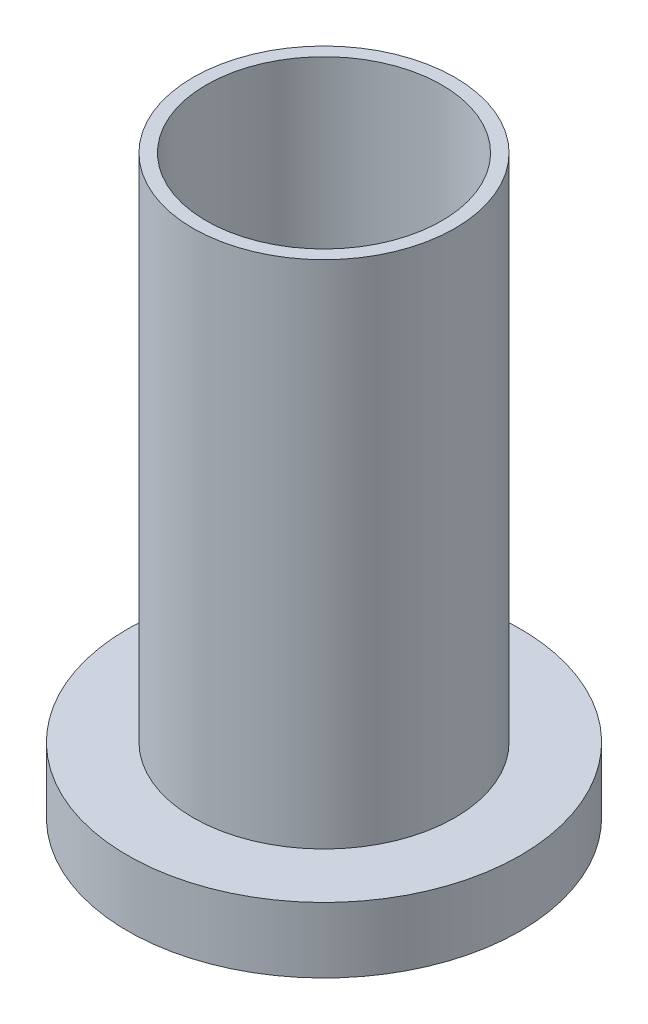
ISO-10303-21;
HEADER;
FILE_DESCRIPTION(('STEP AP214'),'2;1');
FILE_NAME('part.step','',(''),(''),'','','');
FILE_SCHEMA(('AUTOMOTIVE_DESIGN { 1 0 10303 214 1 1 1 1 }'));
ENDSEC;
DATA;
#1=APPLICATION_CONTEXT('core data for automotive mechanical design processes');
#2=APPLICATION_PROTOCOL_DEFINITION('international standard','automotive_design',2000,#1);
#3=PRODUCT_CONTEXT('',#1,'mechanical');
#4=PRODUCT('Part','Part','',(#3));
#5=PRODUCT_RELATED_PRODUCT_CATEGORY('part','',(#4));
#6=PRODUCT_DEFINITION_FORMATION('','',#4);
#7=PRODUCT_DEFINITION_CONTEXT('part definition',#1,'design');
#8=PRODUCT_DEFINITION('design','',#6,#7);
#9=PRODUCT_DEFINITION_SHAPE('','',#8);
#10=(LENGTH_UNIT() NAMED_UNIT(*) SI_UNIT(.MILLI.,.METRE.));
#11=(NAMED_UNIT(*) PLANE_ANGLE_UNIT() SI_UNIT($,.RADIAN.));
#12=(NAMED_UNIT(*) SI_UNIT($,.STERADIAN.) SOLID_ANGLE_UNIT());
#13=UNCERTAINTY_MEASURE_WITH_UNIT(LENGTH_MEASURE(1.E-05),#10,'distance_accuracy_value','');
#14=(GEOMETRIC_REPRESENTATION_CONTEXT(3) GLOBAL_UNCERTAINTY_ASSIGNED_CONTEXT((#13)) GLOBAL_UNIT_ASSIGNED_CONTEXT((#10,
#11,#12)) REPRESENTATION_CONTEXT('',''));
#15=CARTESIAN_POINT('',(0.,0.,0.));
#16=DIRECTION('',(0.,0.,1.));
#17=DIRECTION('',(1.,0.,0.));
#18=AXIS2_PLACEMENT_3D('',#15,#16,#17);
#19=CARTESIAN_POINT('',(1.5,0.,0.));
#20=DIRECTION('',(0.,-1.,0.));
#21=DIRECTION('',(1.,0.,0.));
#22=AXIS2_PLACEMENT_3D('',#19,#20,#21);
#23=PLANE('',#22);
#24=CARTESIAN_POINT('',(1.5,0.,0.));
#25=DIRECTION('',(0.,1.,0.));
#26=DIRECTION('',(-1.,0.,0.));
#27=AXIS2_PLACEMENT_3D('',#24,#25,#26);
#28=CIRCLE('',#27,1.5);
#29=CARTESIAN_POINT('',(0.,0.,0.));
#30=VERTEX_POINT('',#29);
#31=EDGE_CURVE('E11',#30,#30,#28,.T.);
#32=ORIENTED_EDGE('',*,*,#31,.F.);
#33=EDGE_LOOP('',(#32));
#34=FACE_BOUND('',#33,.T.);
#35=ADVANCED_FACE('F43',(#34),#23,.T.);
#36=CARTESIAN_POINT('',(1.5,4.4,0.));
#37=DIRECTION('',(0.,1.,0.));
#38=DIRECTION('',(-1.,0.,0.));
#39=AXIS2_PLACEMENT_3D('',#36,#37,#38);
#40=CYLINDRICAL_SURFACE('',#39,1.5);
#41=ORIENTED_EDGE('',*,*,#31,.T.);
#42=EDGE_LOOP('',(#41));
#43=FACE_BOUND('',#42,.T.);
#44=CARTESIAN_POINT('',(1.5,0.5,0.));
#45=DIRECTION('',(0.,1.,0.));
#46=DIRECTION('',(-1.,0.,0.));
#47=AXIS2_PLACEMENT_3D('',#44,#45,#46);
#48=CIRCLE('',#47,1.5);
#49=CARTESIAN_POINT('',(0.,0.5,0.));
#50=VERTEX_POINT('',#49);
#51=EDGE_CURVE('E50',#50,#50,#48,.T.);
#52=ORIENTED_EDGE('',*,*,#51,.F.);
#53=EDGE_LOOP('',(#52));
#54=FACE_BOUND('',#53,.T.);
#55=ADVANCED_FACE('F93',(#43,#54),#40,.T.);
#56=CARTESIAN_POINT('',(0.,0.5,0.));
#57=DIRECTION('',(0.,1.,0.));
#58=DIRECTION('',(-1.,0.,0.));
#59=AXIS2_PLACEMENT_3D('',#56,#57,#58);
#60=PLANE('',#59);
#61=ORIENTED_EDGE('',*,*,#51,.T.);
#62=EDGE_LOOP('',(#61));
#63=FACE_BOUND('',#62,.T.);
#64=CARTESIAN_POINT('',(1.5,0.5,0.));
#65=DIRECTION('',(0.,1.,0.));
#66=DIRECTION('',(-1.,0.,0.));
#67=AXIS2_PLACEMENT_3D('',#64,#65,#66);
#68=CIRCLE('',#67,1.);
#69=CARTESIAN_POINT('',(0.5,0.5,0.));
#70=VERTEX_POINT('',#69);
#71=EDGE_CURVE('E55',#70,#70,#68,.T.);
#72=ORIENTED_EDGE('',*,*,#71,.F.);
#73=EDGE_LOOP('',(#72));
#74=FACE_BOUND('',#73,.T.);
#75=ADVANCED_FACE('F87',(#63,#74),#60,.T.);
#76=CARTESIAN_POINT('',(1.5,4.4,0.));
#77=DIRECTION('',(0.,1.,0.));
#78=DIRECTION('',(-1.,0.,0.));
#79=AXIS2_PLACEMENT_3D('',#76,#77,#78);
#80=CYLINDRICAL_SURFACE('',#79,1.);
#81=ORIENTED_EDGE('',*,*,#71,.T.);
#82=EDGE_LOOP('',(#81));
#83=FACE_BOUND('',#82,.T.);
#84=CARTESIAN_POINT('',(1.5,4.4,0.));
#85=DIRECTION('',(0.,1.,0.));
#86=DIRECTION('',(-1.,0.,0.));
#87=AXIS2_PLACEMENT_3D('',#84,#85,#86);
#88=CIRCLE('',#87,1.);
#89=CARTESIAN_POINT('',(0.5,4.4,0.));
#90=VERTEX_POINT('',#89);
#91=EDGE_CURVE('E60',#90,#90,#88,.T.);
#92=ORIENTED_EDGE('',*,*,#91,.F.);
#93=EDGE_LOOP('',(#92));
#94=FACE_BOUND('',#93,.T.);
#95=ADVANCED_FACE('F82',(#83,#94),#80,.T.);
#96=CARTESIAN_POINT('',(0.5,4.4,0.));
#97=DIRECTION('',(0.,1.,0.));
#98=DIRECTION('',(-1.,0.,0.));
#99=AXIS2_PLACEMENT_3D('',#96,#97,#98);
#100=PLANE('',#99);
#101=CARTESIAN_POINT('',(1.5,4.4,0.));
#102=DIRECTION('',(0.,1.,0.));
#103=DIRECTION('',(-1.,0.,0.));
#104=AXIS2_PLACEMENT_3D('',#101,#102,#103);
#105=CIRCLE('',#104,0.9);
#106=CARTESIAN_POINT('',(0.6,4.4,0.));
#107=VERTEX_POINT('',#106);
#108=EDGE_CURVE('E70',#107,#107,#105,.T.);
#109=ORIENTED_EDGE('',*,*,#108,.F.);
#110=EDGE_LOOP('',(#109));
#111=FACE_BOUND('',#110,.T.);
#112=ORIENTED_EDGE('',*,*,#91,.T.);
#113=EDGE_LOOP('',(#112));
#114=FACE_BOUND('',#113,.T.);
#115=ADVANCED_FACE('F78',(#111,#114),#100,.T.);
#116=CARTESIAN_POINT('',(1.5,0.5,0.));
#117=DIRECTION('',(0.,-1.,0.));
#118=DIRECTION('',(1.,0.,0.));
#119=AXIS2_PLACEMENT_3D('',#116,#117,#118);
#120=PLANE('',#119);
#121=CARTESIAN_POINT('',(1.5,0.5,0.));
#122=DIRECTION('',(0.,-1.,0.));
#123=DIRECTION('',(1.,0.,0.));
#124=AXIS2_PLACEMENT_3D('',#121,#122,#123);
#125=CIRCLE('',#124,0.9);
#126=CARTESIAN_POINT('',(2.4,0.5,0.));
#127=VERTEX_POINT('',#126);
#128=EDGE_CURVE('E66',#127,#127,#125,.F.);
#129=ORIENTED_EDGE('',*,*,#128,.T.);
#130=EDGE_LOOP('',(#129));
#131=FACE_BOUND('',#130,.T.);
#132=ADVANCED_FACE('F81',(#131),#120,.F.);
#133=CARTESIAN_POINT('',(1.5,-2.54558441227157,0.));
#134=DIRECTION('',(0.,1.,0.));
#135=DIRECTION('',(-1.,0.,0.));
#136=AXIS2_PLACEMENT_3D('',#133,#134,#135);
#137=CYLINDRICAL_SURFACE('',#136,0.9);
#138=ORIENTED_EDGE('',*,*,#108,.T.);
#139=EDGE_LOOP('',(#138));
#140=FACE_BOUND('',#139,.T.);
#141=ORIENTED_EDGE('',*,*,#128,.F.);
#142=EDGE_LOOP('',(#141));
#143=FACE_BOUND('',#142,.T.);
#144=ADVANCED_FACE('F75',(#140,#143),#137,.F.);
#145=CLOSED_SHELL('',(#35,#55,#75,#95,#115,#132,#144));
#146=MANIFOLD_SOLID_BREP('B2',#145);
#147=ADVANCED_BREP_SHAPE_REPRESENTATION('',(#18,#146),#14);
#148=SHAPE_DEFINITION_REPRESENTATION(#9,#147);
ENDSEC;
END-ISO-10303-21;
